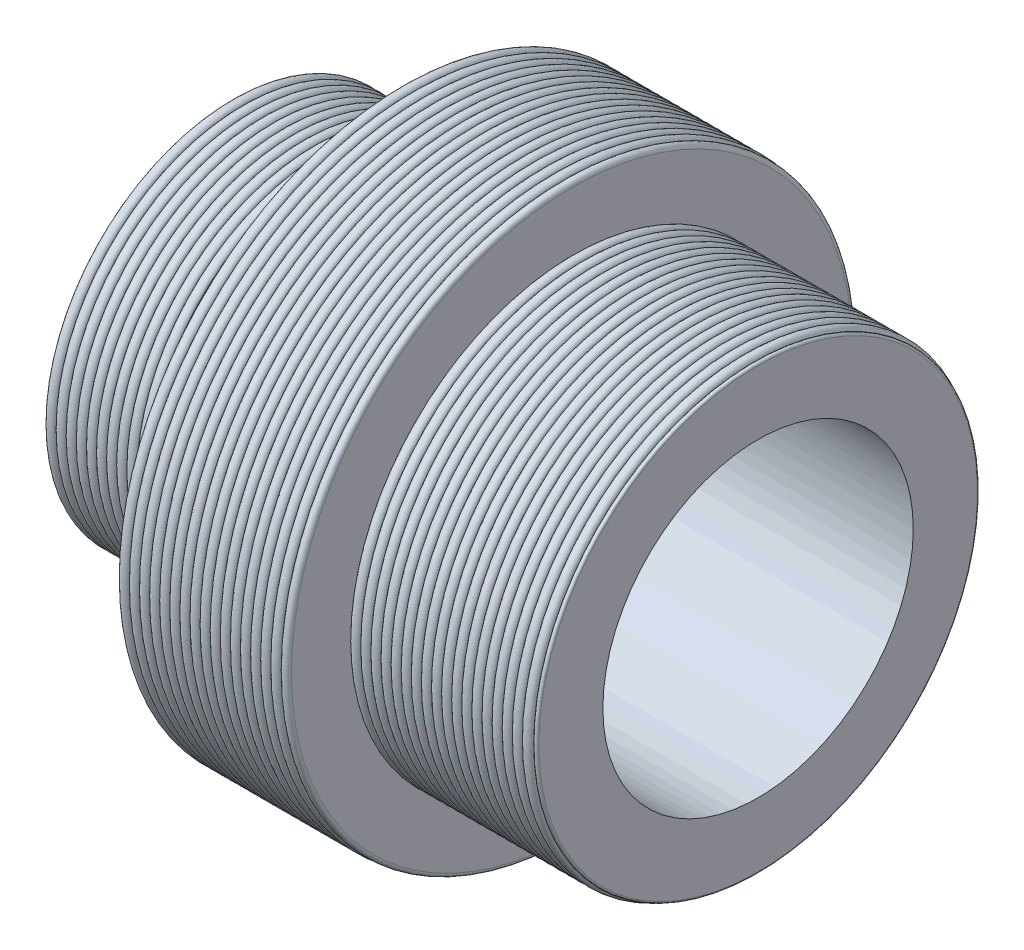
ISO-10303-21;
HEADER;
FILE_DESCRIPTION(('STEP AP214'),'2;1');
FILE_NAME('part.step','',(''),(''),'','','');
FILE_SCHEMA(('AUTOMOTIVE_DESIGN { 1 0 10303 214 1 1 1 1 }'));
ENDSEC;
DATA;
#1=APPLICATION_CONTEXT('core data for automotive mechanical design processes');
#2=APPLICATION_PROTOCOL_DEFINITION('international standard','automotive_design',2000,#1);
#3=PRODUCT_CONTEXT('',#1,'mechanical');
#4=PRODUCT('Part','Part','',(#3));
#5=PRODUCT_RELATED_PRODUCT_CATEGORY('part','',(#4));
#6=PRODUCT_DEFINITION_FORMATION('','',#4);
#7=PRODUCT_DEFINITION_CONTEXT('part definition',#1,'design');
#8=PRODUCT_DEFINITION('design','',#6,#7);
#9=PRODUCT_DEFINITION_SHAPE('','',#8);
#10=(LENGTH_UNIT() NAMED_UNIT(*) SI_UNIT(.MILLI.,.METRE.));
#11=(NAMED_UNIT(*) PLANE_ANGLE_UNIT() SI_UNIT($,.RADIAN.));
#12=(NAMED_UNIT(*) SI_UNIT($,.STERADIAN.) SOLID_ANGLE_UNIT());
#13=UNCERTAINTY_MEASURE_WITH_UNIT(LENGTH_MEASURE(1.E-05),#10,'distance_accuracy_value','');
#14=(GEOMETRIC_REPRESENTATION_CONTEXT(3) GLOBAL_UNCERTAINTY_ASSIGNED_CONTEXT((#13)) GLOBAL_UNIT_ASSIGNED_CONTEXT((#10,
#11,#12)) REPRESENTATION_CONTEXT('',''));
#15=CARTESIAN_POINT('',(0.,0.,0.));
#16=DIRECTION('',(0.,0.,1.));
#17=DIRECTION('',(1.,0.,0.));
#18=AXIS2_PLACEMENT_3D('',#15,#16,#17);
#19=CARTESIAN_POINT('',(-19.8,0.,0.));
#20=DIRECTION('',(-1.,0.,0.));
#21=DIRECTION('',(0.,0.,1.));
#22=AXIS2_PLACEMENT_3D('',#19,#20,#21);
#23=TOROIDAL_SURFACE('',#22,34.565,0.799999999999999);
#24=CARTESIAN_POINT('',(-19.,0.,0.));
#25=DIRECTION('',(-1.,0.,0.));
#26=DIRECTION('',(0.,0.,1.));
#27=AXIS2_PLACEMENT_3D('',#24,#25,#26);
#28=CIRCLE('',#27,34.565);
#29=CARTESIAN_POINT('',(-19.,0.,34.565));
#30=VERTEX_POINT('',#29);
#31=EDGE_CURVE('E274',#30,#30,#28,.T.);
#32=ORIENTED_EDGE('',*,*,#31,.T.);
#33=EDGE_LOOP('',(#32));
#34=FACE_BOUND('',#33,.T.);
#35=CARTESIAN_POINT('',(-20.6,0.,0.));
#36=DIRECTION('',(-1.,0.,0.));
#37=DIRECTION('',(0.,0.,1.));
#38=AXIS2_PLACEMENT_3D('',#35,#36,#37);
#39=CIRCLE('',#38,34.565);
#40=CARTESIAN_POINT('',(-20.6,0.,34.565));
#41=VERTEX_POINT('',#40);
#42=EDGE_CURVE('E10',#41,#41,#39,.T.);
#43=ORIENTED_EDGE('',*,*,#42,.F.);
#44=EDGE_LOOP('',(#43));
#45=FACE_BOUND('',#44,.T.);
#46=ADVANCED_FACE('F39',(#34,#45),#23,.T.);
#47=CARTESIAN_POINT('',(-21.55,0.,0.));
#48=DIRECTION('',(-1.,0.,0.));
#49=DIRECTION('',(0.,0.,1.));
#50=AXIS2_PLACEMENT_3D('',#47,#48,#49);
#51=TOROIDAL_SURFACE('',#50,34.565,0.95);
#52=ORIENTED_EDGE('',*,*,#42,.T.);
#53=EDGE_LOOP('',(#52));
#54=FACE_BOUND('',#53,.T.);
#55=CARTESIAN_POINT('',(-22.5,0.,0.));
#56=DIRECTION('',(-1.,0.,0.));
#57=DIRECTION('',(0.,0.,1.));
#58=AXIS2_PLACEMENT_3D('',#55,#56,#57);
#59=CIRCLE('',#58,34.565);
#60=CARTESIAN_POINT('',(-22.5,0.,34.565));
#61=VERTEX_POINT('',#60);
#62=EDGE_CURVE('E46',#61,#61,#59,.T.);
#63=ORIENTED_EDGE('',*,*,#62,.F.);
#64=EDGE_LOOP('',(#63));
#65=FACE_BOUND('',#64,.T.);
#66=ADVANCED_FACE('F293',(#54,#65),#51,.T.);
#67=CARTESIAN_POINT('',(-23.45,0.,0.));
#68=DIRECTION('',(-1.,0.,0.));
#69=DIRECTION('',(0.,0.,1.));
#70=AXIS2_PLACEMENT_3D('',#67,#68,#69);
#71=TOROIDAL_SURFACE('',#70,34.565,0.95);
#72=ORIENTED_EDGE('',*,*,#62,.T.);
#73=EDGE_LOOP('',(#72));
#74=FACE_BOUND('',#73,.T.);
#75=CARTESIAN_POINT('',(-24.4,0.,0.));
#76=DIRECTION('',(-1.,0.,0.));
#77=DIRECTION('',(0.,0.,1.));
#78=AXIS2_PLACEMENT_3D('',#75,#76,#77);
#79=CIRCLE('',#78,34.565);
#80=CARTESIAN_POINT('',(-24.4,0.,34.565));
#81=VERTEX_POINT('',#80);
#82=EDGE_CURVE('E51',#81,#81,#79,.T.);
#83=ORIENTED_EDGE('',*,*,#82,.F.);
#84=EDGE_LOOP('',(#83));
#85=FACE_BOUND('',#84,.T.);
#86=ADVANCED_FACE('F297',(#74,#85),#71,.T.);
#87=CARTESIAN_POINT('',(-25.35,0.,0.));
#88=DIRECTION('',(-1.,0.,0.));
#89=DIRECTION('',(0.,0.,1.));
#90=AXIS2_PLACEMENT_3D('',#87,#88,#89);
#91=TOROIDAL_SURFACE('',#90,34.565,0.95);
#92=ORIENTED_EDGE('',*,*,#82,.T.);
#93=EDGE_LOOP('',(#92));
#94=FACE_BOUND('',#93,.T.);
#95=CARTESIAN_POINT('',(-26.3,0.,0.));
#96=DIRECTION('',(-1.,0.,0.));
#97=DIRECTION('',(0.,0.,1.));
#98=AXIS2_PLACEMENT_3D('',#95,#96,#97);
#99=CIRCLE('',#98,34.565);
#100=CARTESIAN_POINT('',(-26.3,0.,34.565));
#101=VERTEX_POINT('',#100);
#102=EDGE_CURVE('E56',#101,#101,#99,.T.);
#103=ORIENTED_EDGE('',*,*,#102,.F.);
#104=EDGE_LOOP('',(#103));
#105=FACE_BOUND('',#104,.T.);
#106=ADVANCED_FACE('F301',(#94,#105),#91,.T.);
#107=CARTESIAN_POINT('',(-27.25,0.,0.));
#108=DIRECTION('',(-1.,0.,0.));
#109=DIRECTION('',(0.,0.,1.));
#110=AXIS2_PLACEMENT_3D('',#107,#108,#109);
#111=TOROIDAL_SURFACE('',#110,34.565,0.95);
#112=ORIENTED_EDGE('',*,*,#102,.T.);
#113=EDGE_LOOP('',(#112));
#114=FACE_BOUND('',#113,.T.);
#115=CARTESIAN_POINT('',(-28.2,0.,0.));
#116=DIRECTION('',(-1.,0.,0.));
#117=DIRECTION('',(0.,0.,1.));
#118=AXIS2_PLACEMENT_3D('',#115,#116,#117);
#119=CIRCLE('',#118,34.565);
#120=CARTESIAN_POINT('',(-28.2,0.,34.565));
#121=VERTEX_POINT('',#120);
#122=EDGE_CURVE('E62',#121,#121,#119,.T.);
#123=ORIENTED_EDGE('',*,*,#122,.F.);
#124=EDGE_LOOP('',(#123));
#125=FACE_BOUND('',#124,.T.);
#126=ADVANCED_FACE('F307',(#114,#125),#111,.T.);
#127=CARTESIAN_POINT('',(-29.15,0.,0.));
#128=DIRECTION('',(-1.,0.,0.));
#129=DIRECTION('',(0.,0.,1.));
#130=AXIS2_PLACEMENT_3D('',#127,#128,#129);
#131=TOROIDAL_SURFACE('',#130,34.565,0.95);
#132=ORIENTED_EDGE('',*,*,#122,.T.);
#133=EDGE_LOOP('',(#132));
#134=FACE_BOUND('',#133,.T.);
#135=CARTESIAN_POINT('',(-30.1,0.,0.));
#136=DIRECTION('',(-1.,0.,0.));
#137=DIRECTION('',(0.,0.,1.));
#138=AXIS2_PLACEMENT_3D('',#135,#136,#137);
#139=CIRCLE('',#138,34.565);
#140=CARTESIAN_POINT('',(-30.1,0.,34.565));
#141=VERTEX_POINT('',#140);
#142=EDGE_CURVE('E66',#141,#141,#139,.T.);
#143=ORIENTED_EDGE('',*,*,#142,.F.);
#144=EDGE_LOOP('',(#143));
#145=FACE_BOUND('',#144,.T.);
#146=ADVANCED_FACE('F311',(#134,#145),#131,.T.);
#147=CARTESIAN_POINT('',(-31.05,0.,0.));
#148=DIRECTION('',(-1.,0.,0.));
#149=DIRECTION('',(0.,0.,1.));
#150=AXIS2_PLACEMENT_3D('',#147,#148,#149);
#151=TOROIDAL_SURFACE('',#150,34.565,0.95);
#152=ORIENTED_EDGE('',*,*,#142,.T.);
#153=EDGE_LOOP('',(#152));
#154=FACE_BOUND('',#153,.T.);
#155=CARTESIAN_POINT('',(-32.,0.,0.));
#156=DIRECTION('',(-1.,0.,0.));
#157=DIRECTION('',(0.,0.,1.));
#158=AXIS2_PLACEMENT_3D('',#155,#156,#157);
#159=CIRCLE('',#158,34.565);
#160=CARTESIAN_POINT('',(-32.,0.,34.565));
#161=VERTEX_POINT('',#160);
#162=EDGE_CURVE('E70',#161,#161,#159,.T.);
#163=ORIENTED_EDGE('',*,*,#162,.F.);
#164=EDGE_LOOP('',(#163));
#165=FACE_BOUND('',#164,.T.);
#166=ADVANCED_FACE('F315',(#154,#165),#151,.T.);
#167=CARTESIAN_POINT('',(-32.95,0.,0.));
#168=DIRECTION('',(-1.,0.,0.));
#169=DIRECTION('',(0.,0.,1.));
#170=AXIS2_PLACEMENT_3D('',#167,#168,#169);
#171=TOROIDAL_SURFACE('',#170,34.565,0.95);
#172=ORIENTED_EDGE('',*,*,#162,.T.);
#173=EDGE_LOOP('',(#172));
#174=FACE_BOUND('',#173,.T.);
#175=CARTESIAN_POINT('',(-33.9,0.,0.));
#176=DIRECTION('',(-1.,0.,0.));
#177=DIRECTION('',(0.,0.,1.));
#178=AXIS2_PLACEMENT_3D('',#175,#176,#177);
#179=CIRCLE('',#178,34.565);
#180=CARTESIAN_POINT('',(-33.9,0.,34.565));
#181=VERTEX_POINT('',#180);
#182=EDGE_CURVE('E74',#181,#181,#179,.T.);
#183=ORIENTED_EDGE('',*,*,#182,.F.);
#184=EDGE_LOOP('',(#183));
#185=FACE_BOUND('',#184,.T.);
#186=ADVANCED_FACE('F319',(#174,#185),#171,.T.);
#187=CARTESIAN_POINT('',(-34.85,0.,0.));
#188=DIRECTION('',(-1.,0.,0.));
#189=DIRECTION('',(0.,0.,1.));
#190=AXIS2_PLACEMENT_3D('',#187,#188,#189);
#191=TOROIDAL_SURFACE('',#190,34.565,0.95);
#192=ORIENTED_EDGE('',*,*,#182,.T.);
#193=EDGE_LOOP('',(#192));
#194=FACE_BOUND('',#193,.T.);
#195=CARTESIAN_POINT('',(-35.8,0.,0.));
#196=DIRECTION('',(-1.,0.,0.));
#197=DIRECTION('',(0.,0.,1.));
#198=AXIS2_PLACEMENT_3D('',#195,#196,#197);
#199=CIRCLE('',#198,34.565);
#200=CARTESIAN_POINT('',(-35.8,0.,34.565));
#201=VERTEX_POINT('',#200);
#202=EDGE_CURVE('E78',#201,#201,#199,.T.);
#203=ORIENTED_EDGE('',*,*,#202,.F.);
#204=EDGE_LOOP('',(#203));
#205=FACE_BOUND('',#204,.T.);
#206=ADVANCED_FACE('F323',(#194,#205),#191,.T.);
#207=CARTESIAN_POINT('',(-36.75,0.,0.));
#208=DIRECTION('',(-1.,0.,0.));
#209=DIRECTION('',(0.,0.,1.));
#210=AXIS2_PLACEMENT_3D('',#207,#208,#209);
#211=TOROIDAL_SURFACE('',#210,34.565,0.95);
#212=ORIENTED_EDGE('',*,*,#202,.T.);
#213=EDGE_LOOP('',(#212));
#214=FACE_BOUND('',#213,.T.);
#215=CARTESIAN_POINT('',(-37.7,0.,0.));
#216=DIRECTION('',(-1.,0.,0.));
#217=DIRECTION('',(0.,0.,1.));
#218=AXIS2_PLACEMENT_3D('',#215,#216,#217);
#219=CIRCLE('',#218,34.565);
#220=CARTESIAN_POINT('',(-37.7,0.,34.565));
#221=VERTEX_POINT('',#220);
#222=EDGE_CURVE('E82',#221,#221,#219,.T.);
#223=ORIENTED_EDGE('',*,*,#222,.F.);
#224=EDGE_LOOP('',(#223));
#225=FACE_BOUND('',#224,.T.);
#226=ADVANCED_FACE('F327',(#214,#225),#211,.T.);
#227=CARTESIAN_POINT('',(-38.65,0.,0.));
#228=DIRECTION('',(-1.,0.,0.));
#229=DIRECTION('',(0.,0.,1.));
#230=AXIS2_PLACEMENT_3D('',#227,#228,#229);
#231=TOROIDAL_SURFACE('',#230,34.565,0.95);
#232=ORIENTED_EDGE('',*,*,#222,.T.);
#233=EDGE_LOOP('',(#232));
#234=FACE_BOUND('',#233,.T.);
#235=CARTESIAN_POINT('',(-39.6,0.,0.));
#236=DIRECTION('',(-1.,0.,0.));
#237=DIRECTION('',(0.,0.,1.));
#238=AXIS2_PLACEMENT_3D('',#235,#236,#237);
#239=CIRCLE('',#238,34.565);
#240=CARTESIAN_POINT('',(-39.6,0.,34.565));
#241=VERTEX_POINT('',#240);
#242=EDGE_CURVE('E86',#241,#241,#239,.T.);
#243=ORIENTED_EDGE('',*,*,#242,.F.);
#244=EDGE_LOOP('',(#243));
#245=FACE_BOUND('',#244,.T.);
#246=ADVANCED_FACE('F331',(#234,#245),#231,.T.);
#247=CARTESIAN_POINT('',(-40.55,0.,0.));
#248=DIRECTION('',(-1.,0.,0.));
#249=DIRECTION('',(0.,0.,1.));
#250=AXIS2_PLACEMENT_3D('',#247,#248,#249);
#251=TOROIDAL_SURFACE('',#250,34.565,0.95);
#252=ORIENTED_EDGE('',*,*,#242,.T.);
#253=EDGE_LOOP('',(#252));
#254=FACE_BOUND('',#253,.T.);
#255=CARTESIAN_POINT('',(-41.5,0.,0.));
#256=DIRECTION('',(-1.,0.,0.));
#257=DIRECTION('',(0.,0.,1.));
#258=AXIS2_PLACEMENT_3D('',#255,#256,#257);
#259=CIRCLE('',#258,34.565);
#260=CARTESIAN_POINT('',(-41.5,0.,34.565));
#261=VERTEX_POINT('',#260);
#262=EDGE_CURVE('E90',#261,#261,#259,.T.);
#263=ORIENTED_EDGE('',*,*,#262,.F.);
#264=EDGE_LOOP('',(#263));
#265=FACE_BOUND('',#264,.T.);
#266=ADVANCED_FACE('F335',(#254,#265),#251,.T.);
#267=CARTESIAN_POINT('',(-42.45,0.,0.));
#268=DIRECTION('',(-1.,0.,0.));
#269=DIRECTION('',(0.,0.,1.));
#270=AXIS2_PLACEMENT_3D('',#267,#268,#269);
#271=TOROIDAL_SURFACE('',#270,34.565,0.95);
#272=ORIENTED_EDGE('',*,*,#262,.T.);
#273=EDGE_LOOP('',(#272));
#274=FACE_BOUND('',#273,.T.);
#275=CARTESIAN_POINT('',(-43.4,0.,0.));
#276=DIRECTION('',(-1.,0.,0.));
#277=DIRECTION('',(0.,0.,1.));
#278=AXIS2_PLACEMENT_3D('',#275,#276,#277);
#279=CIRCLE('',#278,34.565);
#280=CARTESIAN_POINT('',(-43.4,0.,34.565));
#281=VERTEX_POINT('',#280);
#282=EDGE_CURVE('E94',#281,#281,#279,.T.);
#283=ORIENTED_EDGE('',*,*,#282,.F.);
#284=EDGE_LOOP('',(#283));
#285=FACE_BOUND('',#284,.T.);
#286=ADVANCED_FACE('F339',(#274,#285),#271,.T.);
#287=CARTESIAN_POINT('',(-44.35,0.,0.));
#288=DIRECTION('',(-1.,0.,0.));
#289=DIRECTION('',(0.,0.,1.));
#290=AXIS2_PLACEMENT_3D('',#287,#288,#289);
#291=TOROIDAL_SURFACE('',#290,34.565,0.95);
#292=ORIENTED_EDGE('',*,*,#282,.T.);
#293=EDGE_LOOP('',(#292));
#294=FACE_BOUND('',#293,.T.);
#295=CARTESIAN_POINT('',(-45.3,0.,0.));
#296=DIRECTION('',(-1.,0.,0.));
#297=DIRECTION('',(0.,0.,1.));
#298=AXIS2_PLACEMENT_3D('',#295,#296,#297);
#299=CIRCLE('',#298,34.565);
#300=CARTESIAN_POINT('',(-45.3,0.,34.565));
#301=VERTEX_POINT('',#300);
#302=EDGE_CURVE('E98',#301,#301,#299,.T.);
#303=ORIENTED_EDGE('',*,*,#302,.F.);
#304=EDGE_LOOP('',(#303));
#305=FACE_BOUND('',#304,.T.);
#306=ADVANCED_FACE('F343',(#294,#305),#291,.T.);
#307=CARTESIAN_POINT('',(-46.25,0.,0.));
#308=DIRECTION('',(-1.,0.,0.));
#309=DIRECTION('',(0.,0.,1.));
#310=AXIS2_PLACEMENT_3D('',#307,#308,#309);
#311=TOROIDAL_SURFACE('',#310,34.565,0.95);
#312=ORIENTED_EDGE('',*,*,#302,.T.);
#313=EDGE_LOOP('',(#312));
#314=FACE_BOUND('',#313,.T.);
#315=CARTESIAN_POINT('',(-47.2,0.,0.));
#316=DIRECTION('',(-1.,0.,0.));
#317=DIRECTION('',(0.,0.,1.));
#318=AXIS2_PLACEMENT_3D('',#315,#316,#317);
#319=CIRCLE('',#318,34.565);
#320=CARTESIAN_POINT('',(-47.2,0.,34.565));
#321=VERTEX_POINT('',#320);
#322=EDGE_CURVE('E102',#321,#321,#319,.T.);
#323=ORIENTED_EDGE('',*,*,#322,.F.);
#324=EDGE_LOOP('',(#323));
#325=FACE_BOUND('',#324,.T.);
#326=ADVANCED_FACE('F347',(#314,#325),#311,.T.);
#327=CARTESIAN_POINT('',(-48.15,0.,0.));
#328=DIRECTION('',(-1.,0.,0.));
#329=DIRECTION('',(0.,0.,1.));
#330=AXIS2_PLACEMENT_3D('',#327,#328,#329);
#331=TOROIDAL_SURFACE('',#330,34.565,0.95);
#332=ORIENTED_EDGE('',*,*,#322,.T.);
#333=EDGE_LOOP('',(#332));
#334=FACE_BOUND('',#333,.T.);
#335=CARTESIAN_POINT('',(-49.1,0.,0.));
#336=DIRECTION('',(-1.,0.,0.));
#337=DIRECTION('',(0.,0.,1.));
#338=AXIS2_PLACEMENT_3D('',#335,#336,#337);
#339=CIRCLE('',#338,34.565);
#340=CARTESIAN_POINT('',(-49.1,0.,34.565));
#341=VERTEX_POINT('',#340);
#342=EDGE_CURVE('E106',#341,#341,#339,.T.);
#343=ORIENTED_EDGE('',*,*,#342,.F.);
#344=EDGE_LOOP('',(#343));
#345=FACE_BOUND('',#344,.T.);
#346=ADVANCED_FACE('F351',(#334,#345),#331,.T.);
#347=CARTESIAN_POINT('',(-50.05,0.,0.));
#348=DIRECTION('',(-1.,0.,0.));
#349=DIRECTION('',(0.,0.,1.));
#350=AXIS2_PLACEMENT_3D('',#347,#348,#349);
#351=TOROIDAL_SURFACE('',#350,34.565,0.95);
#352=ORIENTED_EDGE('',*,*,#342,.T.);
#353=EDGE_LOOP('',(#352));
#354=FACE_BOUND('',#353,.T.);
#355=CARTESIAN_POINT('',(-51.,0.,0.));
#356=DIRECTION('',(-1.,0.,0.));
#357=DIRECTION('',(0.,0.,1.));
#358=AXIS2_PLACEMENT_3D('',#355,#356,#357);
#359=CIRCLE('',#358,34.565);
#360=CARTESIAN_POINT('',(-51.,0.,34.565));
#361=VERTEX_POINT('',#360);
#362=EDGE_CURVE('E110',#361,#361,#359,.T.);
#363=ORIENTED_EDGE('',*,*,#362,.F.);
#364=EDGE_LOOP('',(#363));
#365=FACE_BOUND('',#364,.T.);
#366=ADVANCED_FACE('F355',(#354,#365),#351,.T.);
#367=CARTESIAN_POINT('',(-51.,0.,0.));
#368=DIRECTION('',(-1.,0.,0.));
#369=DIRECTION('',(0.,0.,1.));
#370=AXIS2_PLACEMENT_3D('',#367,#368,#369);
#371=PLANE('',#370);
#372=ORIENTED_EDGE('',*,*,#362,.T.);
#373=EDGE_LOOP('',(#372));
#374=FACE_BOUND('',#373,.T.);
#375=CARTESIAN_POINT('',(-51.,0.,0.));
#376=DIRECTION('',(-1.,0.,0.));
#377=DIRECTION('',(0.,0.,1.));
#378=AXIS2_PLACEMENT_3D('',#375,#376,#377);
#379=CIRCLE('',#378,29.195);
#380=CARTESIAN_POINT('',(-51.,0.,29.195));
#381=VERTEX_POINT('',#380);
#382=EDGE_CURVE('E114',#381,#381,#379,.T.);
#383=ORIENTED_EDGE('',*,*,#382,.F.);
#384=EDGE_LOOP('',(#383));
#385=FACE_BOUND('',#384,.T.);
#386=ADVANCED_FACE('F359',(#374,#385),#371,.T.);
#387=CARTESIAN_POINT('',(-55.,0.,0.));
#388=DIRECTION('',(-1.,0.,0.));
#389=DIRECTION('',(0.,0.,1.));
#390=AXIS2_PLACEMENT_3D('',#387,#388,#389);
#391=CYLINDRICAL_SURFACE('',#390,29.195);
#392=ORIENTED_EDGE('',*,*,#382,.T.);
#393=EDGE_LOOP('',(#392));
#394=FACE_BOUND('',#393,.T.);
#395=CARTESIAN_POINT('',(48.,0.,0.));
#396=DIRECTION('',(-1.,0.,0.));
#397=DIRECTION('',(0.,0.,1.));
#398=AXIS2_PLACEMENT_3D('',#395,#396,#397);
#399=CIRCLE('',#398,29.195);
#400=CARTESIAN_POINT('',(48.,0.,29.195));
#401=VERTEX_POINT('',#400);
#402=EDGE_CURVE('E118',#401,#401,#399,.T.);
#403=ORIENTED_EDGE('',*,*,#402,.F.);
#404=EDGE_LOOP('',(#403));
#405=FACE_BOUND('',#404,.T.);
#406=ADVANCED_FACE('F363',(#394,#405),#391,.F.);
#407=CARTESIAN_POINT('',(48.,0.,0.));
#408=DIRECTION('',(-1.,0.,0.));
#409=DIRECTION('',(0.,0.,1.));
#410=AXIS2_PLACEMENT_3D('',#407,#408,#409);
#411=PLANE('',#410);
#412=CARTESIAN_POINT('',(48.,0.,0.));
#413=DIRECTION('',(-1.,0.,0.));
#414=DIRECTION('',(0.,0.,1.));
#415=AXIS2_PLACEMENT_3D('',#412,#413,#414);
#416=CIRCLE('',#415,41.245);
#417=CARTESIAN_POINT('',(48.,0.,41.245));
#418=VERTEX_POINT('',#417);
#419=EDGE_CURVE('E122',#418,#418,#416,.T.);
#420=ORIENTED_EDGE('',*,*,#419,.F.);
#421=EDGE_LOOP('',(#420));
#422=FACE_BOUND('',#421,.T.);
#423=ORIENTED_EDGE('',*,*,#402,.T.);
#424=EDGE_LOOP('',(#423));
#425=FACE_BOUND('',#424,.T.);
#426=ADVANCED_FACE('F367',(#422,#425),#411,.F.);
#427=CARTESIAN_POINT('',(47.6,0.,0.));
#428=DIRECTION('',(-1.,0.,0.));
#429=DIRECTION('',(0.,0.,1.));
#430=AXIS2_PLACEMENT_3D('',#427,#428,#429);
#431=TOROIDAL_SURFACE('',#430,41.245,0.399999999999998);
#432=ORIENTED_EDGE('',*,*,#419,.T.);
#433=EDGE_LOOP('',(#432));
#434=FACE_BOUND('',#433,.T.);
#435=CARTESIAN_POINT('',(47.2,0.,0.));
#436=DIRECTION('',(-1.,0.,0.));
#437=DIRECTION('',(0.,0.,1.));
#438=AXIS2_PLACEMENT_3D('',#435,#436,#437);
#439=CIRCLE('',#438,41.245);
#440=CARTESIAN_POINT('',(47.2,0.,41.245));
#441=VERTEX_POINT('',#440);
#442=EDGE_CURVE('E126',#441,#441,#439,.T.);
#443=ORIENTED_EDGE('',*,*,#442,.F.);
#444=EDGE_LOOP('',(#443));
#445=FACE_BOUND('',#444,.T.);
#446=ADVANCED_FACE('F371',(#434,#445),#431,.T.);
#447=CARTESIAN_POINT('',(46.25,0.,0.));
#448=DIRECTION('',(-1.,0.,0.));
#449=DIRECTION('',(0.,0.,1.));
#450=AXIS2_PLACEMENT_3D('',#447,#448,#449);
#451=TOROIDAL_SURFACE('',#450,41.245,0.95);
#452=ORIENTED_EDGE('',*,*,#442,.T.);
#453=EDGE_LOOP('',(#452));
#454=FACE_BOUND('',#453,.T.);
#455=CARTESIAN_POINT('',(45.3,0.,0.));
#456=DIRECTION('',(-1.,0.,0.));
#457=DIRECTION('',(0.,0.,1.));
#458=AXIS2_PLACEMENT_3D('',#455,#456,#457);
#459=CIRCLE('',#458,41.245);
#460=CARTESIAN_POINT('',(45.3,0.,41.245));
#461=VERTEX_POINT('',#460);
#462=EDGE_CURVE('E130',#461,#461,#459,.T.);
#463=ORIENTED_EDGE('',*,*,#462,.F.);
#464=EDGE_LOOP('',(#463));
#465=FACE_BOUND('',#464,.T.);
#466=ADVANCED_FACE('F375',(#454,#465),#451,.T.);
#467=CARTESIAN_POINT('',(44.35,0.,0.));
#468=DIRECTION('',(-1.,0.,0.));
#469=DIRECTION('',(0.,0.,1.));
#470=AXIS2_PLACEMENT_3D('',#467,#468,#469);
#471=TOROIDAL_SURFACE('',#470,41.245,0.95);
#472=ORIENTED_EDGE('',*,*,#462,.T.);
#473=EDGE_LOOP('',(#472));
#474=FACE_BOUND('',#473,.T.);
#475=CARTESIAN_POINT('',(43.4,0.,0.));
#476=DIRECTION('',(-1.,0.,0.));
#477=DIRECTION('',(0.,0.,1.));
#478=AXIS2_PLACEMENT_3D('',#475,#476,#477);
#479=CIRCLE('',#478,41.245);
#480=CARTESIAN_POINT('',(43.4,0.,41.245));
#481=VERTEX_POINT('',#480);
#482=EDGE_CURVE('E134',#481,#481,#479,.T.);
#483=ORIENTED_EDGE('',*,*,#482,.F.);
#484=EDGE_LOOP('',(#483));
#485=FACE_BOUND('',#484,.T.);
#486=ADVANCED_FACE('F379',(#474,#485),#471,.T.);
#487=CARTESIAN_POINT('',(42.45,0.,0.));
#488=DIRECTION('',(-1.,0.,0.));
#489=DIRECTION('',(0.,0.,1.));
#490=AXIS2_PLACEMENT_3D('',#487,#488,#489);
#491=TOROIDAL_SURFACE('',#490,41.245,0.95);
#492=ORIENTED_EDGE('',*,*,#482,.T.);
#493=EDGE_LOOP('',(#492));
#494=FACE_BOUND('',#493,.T.);
#495=CARTESIAN_POINT('',(41.5,0.,0.));
#496=DIRECTION('',(-1.,0.,0.));
#497=DIRECTION('',(0.,0.,1.));
#498=AXIS2_PLACEMENT_3D('',#495,#496,#497);
#499=CIRCLE('',#498,41.245);
#500=CARTESIAN_POINT('',(41.5,0.,41.245));
#501=VERTEX_POINT('',#500);
#502=EDGE_CURVE('E138',#501,#501,#499,.T.);
#503=ORIENTED_EDGE('',*,*,#502,.F.);
#504=EDGE_LOOP('',(#503));
#505=FACE_BOUND('',#504,.T.);
#506=ADVANCED_FACE('F383',(#494,#505),#491,.T.);
#507=CARTESIAN_POINT('',(40.55,0.,0.));
#508=DIRECTION('',(-1.,0.,0.));
#509=DIRECTION('',(0.,0.,1.));
#510=AXIS2_PLACEMENT_3D('',#507,#508,#509);
#511=TOROIDAL_SURFACE('',#510,41.245,0.95);
#512=ORIENTED_EDGE('',*,*,#502,.T.);
#513=EDGE_LOOP('',(#512));
#514=FACE_BOUND('',#513,.T.);
#515=CARTESIAN_POINT('',(39.6,0.,0.));
#516=DIRECTION('',(-1.,0.,0.));
#517=DIRECTION('',(0.,0.,1.));
#518=AXIS2_PLACEMENT_3D('',#515,#516,#517);
#519=CIRCLE('',#518,41.245);
#520=CARTESIAN_POINT('',(39.6,0.,41.245));
#521=VERTEX_POINT('',#520);
#522=EDGE_CURVE('E142',#521,#521,#519,.T.);
#523=ORIENTED_EDGE('',*,*,#522,.F.);
#524=EDGE_LOOP('',(#523));
#525=FACE_BOUND('',#524,.T.);
#526=ADVANCED_FACE('F387',(#514,#525),#511,.T.);
#527=CARTESIAN_POINT('',(38.65,0.,0.));
#528=DIRECTION('',(-1.,0.,0.));
#529=DIRECTION('',(0.,0.,1.));
#530=AXIS2_PLACEMENT_3D('',#527,#528,#529);
#531=TOROIDAL_SURFACE('',#530,41.245,0.95);
#532=ORIENTED_EDGE('',*,*,#522,.T.);
#533=EDGE_LOOP('',(#532));
#534=FACE_BOUND('',#533,.T.);
#535=CARTESIAN_POINT('',(37.7,0.,0.));
#536=DIRECTION('',(-1.,0.,0.));
#537=DIRECTION('',(0.,0.,1.));
#538=AXIS2_PLACEMENT_3D('',#535,#536,#537);
#539=CIRCLE('',#538,41.245);
#540=CARTESIAN_POINT('',(37.7,0.,41.245));
#541=VERTEX_POINT('',#540);
#542=EDGE_CURVE('E146',#541,#541,#539,.T.);
#543=ORIENTED_EDGE('',*,*,#542,.F.);
#544=EDGE_LOOP('',(#543));
#545=FACE_BOUND('',#544,.T.);
#546=ADVANCED_FACE('F391',(#534,#545),#531,.T.);
#547=CARTESIAN_POINT('',(36.75,0.,0.));
#548=DIRECTION('',(-1.,0.,0.));
#549=DIRECTION('',(0.,0.,1.));
#550=AXIS2_PLACEMENT_3D('',#547,#548,#549);
#551=TOROIDAL_SURFACE('',#550,41.245,0.95);
#552=ORIENTED_EDGE('',*,*,#542,.T.);
#553=EDGE_LOOP('',(#552));
#554=FACE_BOUND('',#553,.T.);
#555=CARTESIAN_POINT('',(35.8,0.,0.));
#556=DIRECTION('',(-1.,0.,0.));
#557=DIRECTION('',(0.,0.,1.));
#558=AXIS2_PLACEMENT_3D('',#555,#556,#557);
#559=CIRCLE('',#558,41.245);
#560=CARTESIAN_POINT('',(35.8,0.,41.245));
#561=VERTEX_POINT('',#560);
#562=EDGE_CURVE('E150',#561,#561,#559,.T.);
#563=ORIENTED_EDGE('',*,*,#562,.F.);
#564=EDGE_LOOP('',(#563));
#565=FACE_BOUND('',#564,.T.);
#566=ADVANCED_FACE('F395',(#554,#565),#551,.T.);
#567=CARTESIAN_POINT('',(34.85,0.,0.));
#568=DIRECTION('',(-1.,0.,0.));
#569=DIRECTION('',(0.,0.,1.));
#570=AXIS2_PLACEMENT_3D('',#567,#568,#569);
#571=TOROIDAL_SURFACE('',#570,41.245,0.95);
#572=ORIENTED_EDGE('',*,*,#562,.T.);
#573=EDGE_LOOP('',(#572));
#574=FACE_BOUND('',#573,.T.);
#575=CARTESIAN_POINT('',(33.9,0.,0.));
#576=DIRECTION('',(-1.,0.,0.));
#577=DIRECTION('',(0.,0.,1.));
#578=AXIS2_PLACEMENT_3D('',#575,#576,#577);
#579=CIRCLE('',#578,41.245);
#580=CARTESIAN_POINT('',(33.9,0.,41.245));
#581=VERTEX_POINT('',#580);
#582=EDGE_CURVE('E154',#581,#581,#579,.T.);
#583=ORIENTED_EDGE('',*,*,#582,.F.);
#584=EDGE_LOOP('',(#583));
#585=FACE_BOUND('',#584,.T.);
#586=ADVANCED_FACE('F399',(#574,#585),#571,.T.);
#587=CARTESIAN_POINT('',(32.95,0.,0.));
#588=DIRECTION('',(-1.,0.,0.));
#589=DIRECTION('',(0.,0.,1.));
#590=AXIS2_PLACEMENT_3D('',#587,#588,#589);
#591=TOROIDAL_SURFACE('',#590,41.245,0.95);
#592=ORIENTED_EDGE('',*,*,#582,.T.);
#593=EDGE_LOOP('',(#592));
#594=FACE_BOUND('',#593,.T.);
#595=CARTESIAN_POINT('',(32.,0.,0.));
#596=DIRECTION('',(-1.,0.,0.));
#597=DIRECTION('',(0.,0.,1.));
#598=AXIS2_PLACEMENT_3D('',#595,#596,#597);
#599=CIRCLE('',#598,41.245);
#600=CARTESIAN_POINT('',(32.,0.,41.245));
#601=VERTEX_POINT('',#600);
#602=EDGE_CURVE('E158',#601,#601,#599,.T.);
#603=ORIENTED_EDGE('',*,*,#602,.F.);
#604=EDGE_LOOP('',(#603));
#605=FACE_BOUND('',#604,.T.);
#606=ADVANCED_FACE('F403',(#594,#605),#591,.T.);
#607=CARTESIAN_POINT('',(31.05,0.,0.));
#608=DIRECTION('',(-1.,0.,0.));
#609=DIRECTION('',(0.,0.,1.));
#610=AXIS2_PLACEMENT_3D('',#607,#608,#609);
#611=TOROIDAL_SURFACE('',#610,41.245,0.95);
#612=ORIENTED_EDGE('',*,*,#602,.T.);
#613=EDGE_LOOP('',(#612));
#614=FACE_BOUND('',#613,.T.);
#615=CARTESIAN_POINT('',(30.1,0.,0.));
#616=DIRECTION('',(-1.,0.,0.));
#617=DIRECTION('',(0.,0.,1.));
#618=AXIS2_PLACEMENT_3D('',#615,#616,#617);
#619=CIRCLE('',#618,41.245);
#620=CARTESIAN_POINT('',(30.1,0.,41.245));
#621=VERTEX_POINT('',#620);
#622=EDGE_CURVE('E162',#621,#621,#619,.T.);
#623=ORIENTED_EDGE('',*,*,#622,.F.);
#624=EDGE_LOOP('',(#623));
#625=FACE_BOUND('',#624,.T.);
#626=ADVANCED_FACE('F407',(#614,#625),#611,.T.);
#627=CARTESIAN_POINT('',(29.15,0.,0.));
#628=DIRECTION('',(-1.,0.,0.));
#629=DIRECTION('',(0.,0.,1.));
#630=AXIS2_PLACEMENT_3D('',#627,#628,#629);
#631=TOROIDAL_SURFACE('',#630,41.245,0.95);
#632=ORIENTED_EDGE('',*,*,#622,.T.);
#633=EDGE_LOOP('',(#632));
#634=FACE_BOUND('',#633,.T.);
#635=CARTESIAN_POINT('',(28.2,0.,0.));
#636=DIRECTION('',(-1.,0.,0.));
#637=DIRECTION('',(0.,0.,1.));
#638=AXIS2_PLACEMENT_3D('',#635,#636,#637);
#639=CIRCLE('',#638,41.245);
#640=CARTESIAN_POINT('',(28.2,0.,41.245));
#641=VERTEX_POINT('',#640);
#642=EDGE_CURVE('E166',#641,#641,#639,.T.);
#643=ORIENTED_EDGE('',*,*,#642,.F.);
#644=EDGE_LOOP('',(#643));
#645=FACE_BOUND('',#644,.T.);
#646=ADVANCED_FACE('F411',(#634,#645),#631,.T.);
#647=CARTESIAN_POINT('',(27.25,0.,0.));
#648=DIRECTION('',(-1.,0.,0.));
#649=DIRECTION('',(0.,0.,1.));
#650=AXIS2_PLACEMENT_3D('',#647,#648,#649);
#651=TOROIDAL_SURFACE('',#650,41.245,0.95);
#652=ORIENTED_EDGE('',*,*,#642,.T.);
#653=EDGE_LOOP('',(#652));
#654=FACE_BOUND('',#653,.T.);
#655=CARTESIAN_POINT('',(26.3,0.,0.));
#656=DIRECTION('',(-1.,0.,0.));
#657=DIRECTION('',(0.,0.,1.));
#658=AXIS2_PLACEMENT_3D('',#655,#656,#657);
#659=CIRCLE('',#658,41.245);
#660=CARTESIAN_POINT('',(26.3,0.,41.245));
#661=VERTEX_POINT('',#660);
#662=EDGE_CURVE('E170',#661,#661,#659,.T.);
#663=ORIENTED_EDGE('',*,*,#662,.F.);
#664=EDGE_LOOP('',(#663));
#665=FACE_BOUND('',#664,.T.);
#666=ADVANCED_FACE('F415',(#654,#665),#651,.T.);
#667=CARTESIAN_POINT('',(25.35,0.,0.));
#668=DIRECTION('',(-1.,0.,0.));
#669=DIRECTION('',(0.,0.,1.));
#670=AXIS2_PLACEMENT_3D('',#667,#668,#669);
#671=TOROIDAL_SURFACE('',#670,41.245,0.95);
#672=ORIENTED_EDGE('',*,*,#662,.T.);
#673=EDGE_LOOP('',(#672));
#674=FACE_BOUND('',#673,.T.);
#675=CARTESIAN_POINT('',(24.4,0.,0.));
#676=DIRECTION('',(-1.,0.,0.));
#677=DIRECTION('',(0.,0.,1.));
#678=AXIS2_PLACEMENT_3D('',#675,#676,#677);
#679=CIRCLE('',#678,41.245);
#680=CARTESIAN_POINT('',(24.4,0.,41.245));
#681=VERTEX_POINT('',#680);
#682=EDGE_CURVE('E174',#681,#681,#679,.T.);
#683=ORIENTED_EDGE('',*,*,#682,.F.);
#684=EDGE_LOOP('',(#683));
#685=FACE_BOUND('',#684,.T.);
#686=ADVANCED_FACE('F419',(#674,#685),#671,.T.);
#687=CARTESIAN_POINT('',(23.45,0.,0.));
#688=DIRECTION('',(-1.,0.,0.));
#689=DIRECTION('',(0.,0.,1.));
#690=AXIS2_PLACEMENT_3D('',#687,#688,#689);
#691=TOROIDAL_SURFACE('',#690,41.245,0.95);
#692=ORIENTED_EDGE('',*,*,#682,.T.);
#693=EDGE_LOOP('',(#692));
#694=FACE_BOUND('',#693,.T.);
#695=CARTESIAN_POINT('',(22.5,0.,0.));
#696=DIRECTION('',(-1.,0.,0.));
#697=DIRECTION('',(0.,0.,1.));
#698=AXIS2_PLACEMENT_3D('',#695,#696,#697);
#699=CIRCLE('',#698,41.245);
#700=CARTESIAN_POINT('',(22.5,0.,41.245));
#701=VERTEX_POINT('',#700);
#702=EDGE_CURVE('E178',#701,#701,#699,.T.);
#703=ORIENTED_EDGE('',*,*,#702,.F.);
#704=EDGE_LOOP('',(#703));
#705=FACE_BOUND('',#704,.T.);
#706=ADVANCED_FACE('F423',(#694,#705),#691,.T.);
#707=CARTESIAN_POINT('',(21.55,0.,0.));
#708=DIRECTION('',(-1.,0.,0.));
#709=DIRECTION('',(0.,0.,1.));
#710=AXIS2_PLACEMENT_3D('',#707,#708,#709);
#711=TOROIDAL_SURFACE('',#710,41.245,0.95);
#712=ORIENTED_EDGE('',*,*,#702,.T.);
#713=EDGE_LOOP('',(#712));
#714=FACE_BOUND('',#713,.T.);
#715=CARTESIAN_POINT('',(20.6,0.,0.));
#716=DIRECTION('',(-1.,0.,0.));
#717=DIRECTION('',(0.,0.,1.));
#718=AXIS2_PLACEMENT_3D('',#715,#716,#717);
#719=CIRCLE('',#718,41.245);
#720=CARTESIAN_POINT('',(20.6,0.,41.245));
#721=VERTEX_POINT('',#720);
#722=EDGE_CURVE('E182',#721,#721,#719,.T.);
#723=ORIENTED_EDGE('',*,*,#722,.F.);
#724=EDGE_LOOP('',(#723));
#725=FACE_BOUND('',#724,.T.);
#726=ADVANCED_FACE('F427',(#714,#725),#711,.T.);
#727=CARTESIAN_POINT('',(19.65,0.,0.));
#728=DIRECTION('',(-1.,0.,0.));
#729=DIRECTION('',(0.,0.,1.));
#730=AXIS2_PLACEMENT_3D('',#727,#728,#729);
#731=TOROIDAL_SURFACE('',#730,41.245,0.95);
#732=ORIENTED_EDGE('',*,*,#722,.T.);
#733=EDGE_LOOP('',(#732));
#734=FACE_BOUND('',#733,.T.);
#735=CARTESIAN_POINT('',(18.7,0.,0.));
#736=DIRECTION('',(-1.,0.,0.));
#737=DIRECTION('',(0.,0.,1.));
#738=AXIS2_PLACEMENT_3D('',#735,#736,#737);
#739=CIRCLE('',#738,41.245);
#740=CARTESIAN_POINT('',(18.7,0.,41.245));
#741=VERTEX_POINT('',#740);
#742=EDGE_CURVE('E186',#741,#741,#739,.T.);
#743=ORIENTED_EDGE('',*,*,#742,.F.);
#744=EDGE_LOOP('',(#743));
#745=FACE_BOUND('',#744,.T.);
#746=ADVANCED_FACE('F431',(#734,#745),#731,.T.);
#747=CARTESIAN_POINT('',(17.75,0.,0.));
#748=DIRECTION('',(-1.,0.,0.));
#749=DIRECTION('',(0.,0.,1.));
#750=AXIS2_PLACEMENT_3D('',#747,#748,#749);
#751=TOROIDAL_SURFACE('',#750,41.245,0.95);
#752=ORIENTED_EDGE('',*,*,#742,.T.);
#753=EDGE_LOOP('',(#752));
#754=FACE_BOUND('',#753,.T.);
#755=CARTESIAN_POINT('',(16.8,0.,0.));
#756=DIRECTION('',(-1.,0.,0.));
#757=DIRECTION('',(0.,0.,1.));
#758=AXIS2_PLACEMENT_3D('',#755,#756,#757);
#759=CIRCLE('',#758,41.245);
#760=CARTESIAN_POINT('',(16.8,0.,41.245));
#761=VERTEX_POINT('',#760);
#762=EDGE_CURVE('E190',#761,#761,#759,.T.);
#763=ORIENTED_EDGE('',*,*,#762,.F.);
#764=EDGE_LOOP('',(#763));
#765=FACE_BOUND('',#764,.T.);
#766=ADVANCED_FACE('F435',(#754,#765),#751,.T.);
#767=CARTESIAN_POINT('',(15.85,0.,0.));
#768=DIRECTION('',(-1.,0.,0.));
#769=DIRECTION('',(0.,0.,1.));
#770=AXIS2_PLACEMENT_3D('',#767,#768,#769);
#771=TOROIDAL_SURFACE('',#770,41.245,0.95);
#772=ORIENTED_EDGE('',*,*,#762,.T.);
#773=EDGE_LOOP('',(#772));
#774=FACE_BOUND('',#773,.T.);
#775=CARTESIAN_POINT('',(14.9,0.,0.));
#776=DIRECTION('',(-1.,0.,0.));
#777=DIRECTION('',(0.,0.,1.));
#778=AXIS2_PLACEMENT_3D('',#775,#776,#777);
#779=CIRCLE('',#778,41.245);
#780=CARTESIAN_POINT('',(14.9,0.,41.245));
#781=VERTEX_POINT('',#780);
#782=EDGE_CURVE('E194',#781,#781,#779,.T.);
#783=ORIENTED_EDGE('',*,*,#782,.F.);
#784=EDGE_LOOP('',(#783));
#785=FACE_BOUND('',#784,.T.);
#786=ADVANCED_FACE('F439',(#774,#785),#771,.T.);
#787=CARTESIAN_POINT('',(13.95,0.,0.));
#788=DIRECTION('',(-1.,0.,0.));
#789=DIRECTION('',(0.,0.,1.));
#790=AXIS2_PLACEMENT_3D('',#787,#788,#789);
#791=TOROIDAL_SURFACE('',#790,41.245,0.95);
#792=ORIENTED_EDGE('',*,*,#782,.T.);
#793=EDGE_LOOP('',(#792));
#794=FACE_BOUND('',#793,.T.);
#795=CARTESIAN_POINT('',(13.,0.,0.));
#796=DIRECTION('',(-1.,0.,0.));
#797=DIRECTION('',(0.,0.,1.));
#798=AXIS2_PLACEMENT_3D('',#795,#796,#797);
#799=CIRCLE('',#798,41.245);
#800=CARTESIAN_POINT('',(13.,0.,41.245));
#801=VERTEX_POINT('',#800);
#802=EDGE_CURVE('E198',#801,#801,#799,.T.);
#803=ORIENTED_EDGE('',*,*,#802,.F.);
#804=EDGE_LOOP('',(#803));
#805=FACE_BOUND('',#804,.T.);
#806=ADVANCED_FACE('F443',(#794,#805),#791,.T.);
#807=CARTESIAN_POINT('',(13.,0.,0.));
#808=DIRECTION('',(-1.,0.,0.));
#809=DIRECTION('',(0.,0.,1.));
#810=AXIS2_PLACEMENT_3D('',#807,#808,#809);
#811=PLANE('',#810);
#812=CARTESIAN_POINT('',(13.,0.,0.));
#813=DIRECTION('',(-1.,0.,0.));
#814=DIRECTION('',(0.,0.,1.));
#815=AXIS2_PLACEMENT_3D('',#812,#813,#814);
#816=CIRCLE('',#815,52.78);
#817=CARTESIAN_POINT('',(13.,0.,52.78));
#818=VERTEX_POINT('',#817);
#819=EDGE_CURVE('E202',#818,#818,#816,.T.);
#820=ORIENTED_EDGE('',*,*,#819,.F.);
#821=EDGE_LOOP('',(#820));
#822=FACE_BOUND('',#821,.T.);
#823=ORIENTED_EDGE('',*,*,#802,.T.);
#824=EDGE_LOOP('',(#823));
#825=FACE_BOUND('',#824,.T.);
#826=ADVANCED_FACE('F447',(#822,#825),#811,.F.);
#827=CARTESIAN_POINT('',(12.2,0.,0.));
#828=DIRECTION('',(-1.,0.,0.));
#829=DIRECTION('',(0.,0.,1.));
#830=AXIS2_PLACEMENT_3D('',#827,#828,#829);
#831=TOROIDAL_SURFACE('',#830,52.78,0.800000000000004);
#832=ORIENTED_EDGE('',*,*,#819,.T.);
#833=EDGE_LOOP('',(#832));
#834=FACE_BOUND('',#833,.T.);
#835=CARTESIAN_POINT('',(11.4,0.,0.));
#836=DIRECTION('',(-1.,0.,0.));
#837=DIRECTION('',(0.,0.,1.));
#838=AXIS2_PLACEMENT_3D('',#835,#836,#837);
#839=CIRCLE('',#838,52.78);
#840=CARTESIAN_POINT('',(11.4,0.,52.78));
#841=VERTEX_POINT('',#840);
#842=EDGE_CURVE('E206',#841,#841,#839,.T.);
#843=ORIENTED_EDGE('',*,*,#842,.F.);
#844=EDGE_LOOP('',(#843));
#845=FACE_BOUND('',#844,.T.);
#846=ADVANCED_FACE('F451',(#834,#845),#831,.T.);
#847=CARTESIAN_POINT('',(10.45,0.,0.));
#848=DIRECTION('',(-1.,0.,0.));
#849=DIRECTION('',(0.,0.,1.));
#850=AXIS2_PLACEMENT_3D('',#847,#848,#849);
#851=TOROIDAL_SURFACE('',#850,52.78,0.949999999999998);
#852=ORIENTED_EDGE('',*,*,#842,.T.);
#853=EDGE_LOOP('',(#852));
#854=FACE_BOUND('',#853,.T.);
#855=CARTESIAN_POINT('',(9.5,0.,0.));
#856=DIRECTION('',(-1.,0.,0.));
#857=DIRECTION('',(0.,0.,1.));
#858=AXIS2_PLACEMENT_3D('',#855,#856,#857);
#859=CIRCLE('',#858,52.78);
#860=CARTESIAN_POINT('',(9.5,0.,52.78));
#861=VERTEX_POINT('',#860);
#862=EDGE_CURVE('E210',#861,#861,#859,.T.);
#863=ORIENTED_EDGE('',*,*,#862,.F.);
#864=EDGE_LOOP('',(#863));
#865=FACE_BOUND('',#864,.T.);
#866=ADVANCED_FACE('F455',(#854,#865),#851,.T.);
#867=CARTESIAN_POINT('',(8.54999999999999,0.,0.));
#868=DIRECTION('',(-1.,0.,0.));
#869=DIRECTION('',(0.,0.,1.));
#870=AXIS2_PLACEMENT_3D('',#867,#868,#869);
#871=TOROIDAL_SURFACE('',#870,52.78,0.950000000000001);
#872=ORIENTED_EDGE('',*,*,#862,.T.);
#873=EDGE_LOOP('',(#872));
#874=FACE_BOUND('',#873,.T.);
#875=CARTESIAN_POINT('',(7.59999999999999,0.,0.));
#876=DIRECTION('',(-1.,0.,0.));
#877=DIRECTION('',(0.,0.,1.));
#878=AXIS2_PLACEMENT_3D('',#875,#876,#877);
#879=CIRCLE('',#878,52.78);
#880=CARTESIAN_POINT('',(7.59999999999999,0.,52.78));
#881=VERTEX_POINT('',#880);
#882=EDGE_CURVE('E214',#881,#881,#879,.T.);
#883=ORIENTED_EDGE('',*,*,#882,.F.);
#884=EDGE_LOOP('',(#883));
#885=FACE_BOUND('',#884,.T.);
#886=ADVANCED_FACE('F459',(#874,#885),#871,.T.);
#887=CARTESIAN_POINT('',(6.64999999999999,0.,0.));
#888=DIRECTION('',(-1.,0.,0.));
#889=DIRECTION('',(0.,0.,1.));
#890=AXIS2_PLACEMENT_3D('',#887,#888,#889);
#891=TOROIDAL_SURFACE('',#890,52.78,0.95);
#892=ORIENTED_EDGE('',*,*,#882,.T.);
#893=EDGE_LOOP('',(#892));
#894=FACE_BOUND('',#893,.T.);
#895=CARTESIAN_POINT('',(5.69999999999999,0.,0.));
#896=DIRECTION('',(-1.,0.,0.));
#897=DIRECTION('',(0.,0.,1.));
#898=AXIS2_PLACEMENT_3D('',#895,#896,#897);
#899=CIRCLE('',#898,52.78);
#900=CARTESIAN_POINT('',(5.69999999999999,0.,52.78));
#901=VERTEX_POINT('',#900);
#902=EDGE_CURVE('E218',#901,#901,#899,.T.);
#903=ORIENTED_EDGE('',*,*,#902,.F.);
#904=EDGE_LOOP('',(#903));
#905=FACE_BOUND('',#904,.T.);
#906=ADVANCED_FACE('F463',(#894,#905),#891,.T.);
#907=CARTESIAN_POINT('',(4.74999999999999,0.,0.));
#908=DIRECTION('',(-1.,0.,0.));
#909=DIRECTION('',(0.,0.,1.));
#910=AXIS2_PLACEMENT_3D('',#907,#908,#909);
#911=TOROIDAL_SURFACE('',#910,52.78,0.950000000000001);
#912=ORIENTED_EDGE('',*,*,#902,.T.);
#913=EDGE_LOOP('',(#912));
#914=FACE_BOUND('',#913,.T.);
#915=CARTESIAN_POINT('',(3.79999999999999,0.,0.));
#916=DIRECTION('',(-1.,0.,0.));
#917=DIRECTION('',(0.,0.,1.));
#918=AXIS2_PLACEMENT_3D('',#915,#916,#917);
#919=CIRCLE('',#918,52.78);
#920=CARTESIAN_POINT('',(3.79999999999999,0.,52.78));
#921=VERTEX_POINT('',#920);
#922=EDGE_CURVE('E222',#921,#921,#919,.T.);
#923=ORIENTED_EDGE('',*,*,#922,.F.);
#924=EDGE_LOOP('',(#923));
#925=FACE_BOUND('',#924,.T.);
#926=ADVANCED_FACE('F467',(#914,#925),#911,.T.);
#927=CARTESIAN_POINT('',(2.84999999999999,0.,0.));
#928=DIRECTION('',(-1.,0.,0.));
#929=DIRECTION('',(0.,0.,1.));
#930=AXIS2_PLACEMENT_3D('',#927,#928,#929);
#931=TOROIDAL_SURFACE('',#930,52.78,0.95);
#932=ORIENTED_EDGE('',*,*,#922,.T.);
#933=EDGE_LOOP('',(#932));
#934=FACE_BOUND('',#933,.T.);
#935=CARTESIAN_POINT('',(1.89999999999999,0.,0.));
#936=DIRECTION('',(-1.,0.,0.));
#937=DIRECTION('',(0.,0.,1.));
#938=AXIS2_PLACEMENT_3D('',#935,#936,#937);
#939=CIRCLE('',#938,52.78);
#940=CARTESIAN_POINT('',(1.89999999999999,0.,52.78));
#941=VERTEX_POINT('',#940);
#942=EDGE_CURVE('E226',#941,#941,#939,.T.);
#943=ORIENTED_EDGE('',*,*,#942,.F.);
#944=EDGE_LOOP('',(#943));
#945=FACE_BOUND('',#944,.T.);
#946=ADVANCED_FACE('F471',(#934,#945),#931,.T.);
#947=CARTESIAN_POINT('',(0.949999999999992,0.,0.));
#948=DIRECTION('',(-1.,0.,0.));
#949=DIRECTION('',(0.,0.,1.));
#950=AXIS2_PLACEMENT_3D('',#947,#948,#949);
#951=TOROIDAL_SURFACE('',#950,52.78,0.95);
#952=ORIENTED_EDGE('',*,*,#942,.T.);
#953=EDGE_LOOP('',(#952));
#954=FACE_BOUND('',#953,.T.);
#955=CARTESIAN_POINT('',(0.,0.,0.));
#956=DIRECTION('',(-1.,0.,0.));
#957=DIRECTION('',(0.,0.,1.));
#958=AXIS2_PLACEMENT_3D('',#955,#956,#957);
#959=CIRCLE('',#958,52.78);
#960=CARTESIAN_POINT('',(0.,0.,52.78));
#961=VERTEX_POINT('',#960);
#962=EDGE_CURVE('E230',#961,#961,#959,.T.);
#963=ORIENTED_EDGE('',*,*,#962,.F.);
#964=EDGE_LOOP('',(#963));
#965=FACE_BOUND('',#964,.T.);
#966=ADVANCED_FACE('F475',(#954,#965),#951,.T.);
#967=CARTESIAN_POINT('',(-0.950000000000008,0.,0.));
#968=DIRECTION('',(-1.,0.,0.));
#969=DIRECTION('',(0.,0.,1.));
#970=AXIS2_PLACEMENT_3D('',#967,#968,#969);
#971=TOROIDAL_SURFACE('',#970,52.78,0.95);
#972=ORIENTED_EDGE('',*,*,#962,.T.);
#973=EDGE_LOOP('',(#972));
#974=FACE_BOUND('',#973,.T.);
#975=CARTESIAN_POINT('',(-1.90000000000001,0.,0.));
#976=DIRECTION('',(-1.,0.,0.));
#977=DIRECTION('',(0.,0.,1.));
#978=AXIS2_PLACEMENT_3D('',#975,#976,#977);
#979=CIRCLE('',#978,52.78);
#980=CARTESIAN_POINT('',(-1.90000000000001,0.,52.78));
#981=VERTEX_POINT('',#980);
#982=EDGE_CURVE('E234',#981,#981,#979,.T.);
#983=ORIENTED_EDGE('',*,*,#982,.F.);
#984=EDGE_LOOP('',(#983));
#985=FACE_BOUND('',#984,.T.);
#986=ADVANCED_FACE('F479',(#974,#985),#971,.T.);
#987=CARTESIAN_POINT('',(-2.85000000000001,0.,0.));
#988=DIRECTION('',(-1.,0.,0.));
#989=DIRECTION('',(0.,0.,1.));
#990=AXIS2_PLACEMENT_3D('',#987,#988,#989);
#991=TOROIDAL_SURFACE('',#990,52.78,0.95);
#992=ORIENTED_EDGE('',*,*,#982,.T.);
#993=EDGE_LOOP('',(#992));
#994=FACE_BOUND('',#993,.T.);
#995=CARTESIAN_POINT('',(-3.8,0.,0.));
#996=DIRECTION('',(-1.,0.,0.));
#997=DIRECTION('',(0.,0.,1.));
#998=AXIS2_PLACEMENT_3D('',#995,#996,#997);
#999=CIRCLE('',#998,52.78);
#1000=CARTESIAN_POINT('',(-3.8,0.,52.78));
#1001=VERTEX_POINT('',#1000);
#1002=EDGE_CURVE('E238',#1001,#1001,#999,.T.);
#1003=ORIENTED_EDGE('',*,*,#1002,.F.);
#1004=EDGE_LOOP('',(#1003));
#1005=FACE_BOUND('',#1004,.T.);
#1006=ADVANCED_FACE('F483',(#994,#1005),#991,.T.);
#1007=CARTESIAN_POINT('',(-4.75000000000001,0.,0.));
#1008=DIRECTION('',(-1.,0.,0.));
#1009=DIRECTION('',(0.,0.,1.));
#1010=AXIS2_PLACEMENT_3D('',#1007,#1008,#1009);
#1011=TOROIDAL_SURFACE('',#1010,52.78,0.95);
#1012=ORIENTED_EDGE('',*,*,#1002,.T.);
#1013=EDGE_LOOP('',(#1012));
#1014=FACE_BOUND('',#1013,.T.);
#1015=CARTESIAN_POINT('',(-5.7,0.,0.));
#1016=DIRECTION('',(-1.,0.,0.));
#1017=DIRECTION('',(0.,0.,1.));
#1018=AXIS2_PLACEMENT_3D('',#1015,#1016,#1017);
#1019=CIRCLE('',#1018,52.78);
#1020=CARTESIAN_POINT('',(-5.7,0.,52.78));
#1021=VERTEX_POINT('',#1020);
#1022=EDGE_CURVE('E242',#1021,#1021,#1019,.T.);
#1023=ORIENTED_EDGE('',*,*,#1022,.F.);
#1024=EDGE_LOOP('',(#1023));
#1025=FACE_BOUND('',#1024,.T.);
#1026=ADVANCED_FACE('F487',(#1014,#1025),#1011,.T.);
#1027=CARTESIAN_POINT('',(-6.65000000000001,0.,0.));
#1028=DIRECTION('',(-1.,0.,0.));
#1029=DIRECTION('',(0.,0.,1.));
#1030=AXIS2_PLACEMENT_3D('',#1027,#1028,#1029);
#1031=TOROIDAL_SURFACE('',#1030,52.78,0.950000000000001);
#1032=ORIENTED_EDGE('',*,*,#1022,.T.);
#1033=EDGE_LOOP('',(#1032));
#1034=FACE_BOUND('',#1033,.T.);
#1035=CARTESIAN_POINT('',(-7.60000000000001,0.,0.));
#1036=DIRECTION('',(-1.,0.,0.));
#1037=DIRECTION('',(0.,0.,1.));
#1038=AXIS2_PLACEMENT_3D('',#1035,#1036,#1037);
#1039=CIRCLE('',#1038,52.78);
#1040=CARTESIAN_POINT('',(-7.60000000000001,0.,52.78));
#1041=VERTEX_POINT('',#1040);
#1042=EDGE_CURVE('E246',#1041,#1041,#1039,.T.);
#1043=ORIENTED_EDGE('',*,*,#1042,.F.);
#1044=EDGE_LOOP('',(#1043));
#1045=FACE_BOUND('',#1044,.T.);
#1046=ADVANCED_FACE('F491',(#1034,#1045),#1031,.T.);
#1047=CARTESIAN_POINT('',(-8.55000000000001,0.,0.));
#1048=DIRECTION('',(-1.,0.,0.));
#1049=DIRECTION('',(0.,0.,1.));
#1050=AXIS2_PLACEMENT_3D('',#1047,#1048,#1049);
#1051=TOROIDAL_SURFACE('',#1050,52.78,0.95);
#1052=ORIENTED_EDGE('',*,*,#1042,.T.);
#1053=EDGE_LOOP('',(#1052));
#1054=FACE_BOUND('',#1053,.T.);
#1055=CARTESIAN_POINT('',(-9.50000000000001,0.,0.));
#1056=DIRECTION('',(-1.,0.,0.));
#1057=DIRECTION('',(0.,0.,1.));
#1058=AXIS2_PLACEMENT_3D('',#1055,#1056,#1057);
#1059=CIRCLE('',#1058,52.78);
#1060=CARTESIAN_POINT('',(-9.50000000000001,0.,52.78));
#1061=VERTEX_POINT('',#1060);
#1062=EDGE_CURVE('E250',#1061,#1061,#1059,.T.);
#1063=ORIENTED_EDGE('',*,*,#1062,.F.);
#1064=EDGE_LOOP('',(#1063));
#1065=FACE_BOUND('',#1064,.T.);
#1066=ADVANCED_FACE('F495',(#1054,#1065),#1051,.T.);
#1067=CARTESIAN_POINT('',(-10.45,0.,0.));
#1068=DIRECTION('',(-1.,0.,0.));
#1069=DIRECTION('',(0.,0.,1.));
#1070=AXIS2_PLACEMENT_3D('',#1067,#1068,#1069);
#1071=TOROIDAL_SURFACE('',#1070,52.78,0.95);
#1072=ORIENTED_EDGE('',*,*,#1062,.T.);
#1073=EDGE_LOOP('',(#1072));
#1074=FACE_BOUND('',#1073,.T.);
#1075=CARTESIAN_POINT('',(-11.4,0.,0.));
#1076=DIRECTION('',(-1.,0.,0.));
#1077=DIRECTION('',(0.,0.,1.));
#1078=AXIS2_PLACEMENT_3D('',#1075,#1076,#1077);
#1079=CIRCLE('',#1078,52.78);
#1080=CARTESIAN_POINT('',(-11.4,0.,52.78));
#1081=VERTEX_POINT('',#1080);
#1082=EDGE_CURVE('E254',#1081,#1081,#1079,.T.);
#1083=ORIENTED_EDGE('',*,*,#1082,.F.);
#1084=EDGE_LOOP('',(#1083));
#1085=FACE_BOUND('',#1084,.T.);
#1086=ADVANCED_FACE('F499',(#1074,#1085),#1071,.T.);
#1087=CARTESIAN_POINT('',(-12.35,0.,0.));
#1088=DIRECTION('',(-1.,0.,0.));
#1089=DIRECTION('',(0.,0.,1.));
#1090=AXIS2_PLACEMENT_3D('',#1087,#1088,#1089);
#1091=TOROIDAL_SURFACE('',#1090,52.78,0.95);
#1092=ORIENTED_EDGE('',*,*,#1082,.T.);
#1093=EDGE_LOOP('',(#1092));
#1094=FACE_BOUND('',#1093,.T.);
#1095=CARTESIAN_POINT('',(-13.3,0.,0.));
#1096=DIRECTION('',(-1.,0.,0.));
#1097=DIRECTION('',(0.,0.,1.));
#1098=AXIS2_PLACEMENT_3D('',#1095,#1096,#1097);
#1099=CIRCLE('',#1098,52.78);
#1100=CARTESIAN_POINT('',(-13.3,0.,52.78));
#1101=VERTEX_POINT('',#1100);
#1102=EDGE_CURVE('E258',#1101,#1101,#1099,.T.);
#1103=ORIENTED_EDGE('',*,*,#1102,.F.);
#1104=EDGE_LOOP('',(#1103));
#1105=FACE_BOUND('',#1104,.T.);
#1106=ADVANCED_FACE('F503',(#1094,#1105),#1091,.T.);
#1107=CARTESIAN_POINT('',(-14.25,0.,0.));
#1108=DIRECTION('',(-1.,0.,0.));
#1109=DIRECTION('',(0.,0.,1.));
#1110=AXIS2_PLACEMENT_3D('',#1107,#1108,#1109);
#1111=TOROIDAL_SURFACE('',#1110,52.78,0.95);
#1112=ORIENTED_EDGE('',*,*,#1102,.T.);
#1113=EDGE_LOOP('',(#1112));
#1114=FACE_BOUND('',#1113,.T.);
#1115=CARTESIAN_POINT('',(-15.2,0.,0.));
#1116=DIRECTION('',(-1.,0.,0.));
#1117=DIRECTION('',(0.,0.,1.));
#1118=AXIS2_PLACEMENT_3D('',#1115,#1116,#1117);
#1119=CIRCLE('',#1118,52.78);
#1120=CARTESIAN_POINT('',(-15.2,0.,52.78));
#1121=VERTEX_POINT('',#1120);
#1122=EDGE_CURVE('E262',#1121,#1121,#1119,.T.);
#1123=ORIENTED_EDGE('',*,*,#1122,.F.);
#1124=EDGE_LOOP('',(#1123));
#1125=FACE_BOUND('',#1124,.T.);
#1126=ADVANCED_FACE('F507',(#1114,#1125),#1111,.T.);
#1127=CARTESIAN_POINT('',(-16.15,0.,0.));
#1128=DIRECTION('',(-1.,0.,0.));
#1129=DIRECTION('',(0.,0.,1.));
#1130=AXIS2_PLACEMENT_3D('',#1127,#1128,#1129);
#1131=TOROIDAL_SURFACE('',#1130,52.78,0.95);
#1132=ORIENTED_EDGE('',*,*,#1122,.T.);
#1133=EDGE_LOOP('',(#1132));
#1134=FACE_BOUND('',#1133,.T.);
#1135=CARTESIAN_POINT('',(-17.1,0.,0.));
#1136=DIRECTION('',(-1.,0.,0.));
#1137=DIRECTION('',(0.,0.,1.));
#1138=AXIS2_PLACEMENT_3D('',#1135,#1136,#1137);
#1139=CIRCLE('',#1138,52.78);
#1140=CARTESIAN_POINT('',(-17.1,0.,52.78));
#1141=VERTEX_POINT('',#1140);
#1142=EDGE_CURVE('E266',#1141,#1141,#1139,.T.);
#1143=ORIENTED_EDGE('',*,*,#1142,.F.);
#1144=EDGE_LOOP('',(#1143));
#1145=FACE_BOUND('',#1144,.T.);
#1146=ADVANCED_FACE('F289',(#1134,#1145),#1131,.T.);
#1147=CARTESIAN_POINT('',(-18.05,0.,0.));
#1148=DIRECTION('',(-1.,0.,0.));
#1149=DIRECTION('',(0.,0.,1.));
#1150=AXIS2_PLACEMENT_3D('',#1147,#1148,#1149);
#1151=TOROIDAL_SURFACE('',#1150,52.78,0.95);
#1152=ORIENTED_EDGE('',*,*,#1142,.T.);
#1153=EDGE_LOOP('',(#1152));
#1154=FACE_BOUND('',#1153,.T.);
#1155=CARTESIAN_POINT('',(-19.,0.,0.));
#1156=DIRECTION('',(-1.,0.,0.));
#1157=DIRECTION('',(0.,0.,1.));
#1158=AXIS2_PLACEMENT_3D('',#1155,#1156,#1157);
#1159=CIRCLE('',#1158,52.78);
#1160=CARTESIAN_POINT('',(-19.,0.,52.78));
#1161=VERTEX_POINT('',#1160);
#1162=EDGE_CURVE('E270',#1161,#1161,#1159,.T.);
#1163=ORIENTED_EDGE('',*,*,#1162,.F.);
#1164=EDGE_LOOP('',(#1163));
#1165=FACE_BOUND('',#1164,.T.);
#1166=ADVANCED_FACE('F283',(#1154,#1165),#1151,.T.);
#1167=CARTESIAN_POINT('',(-19.,0.,0.));
#1168=DIRECTION('',(-1.,0.,0.));
#1169=DIRECTION('',(0.,0.,1.));
#1170=AXIS2_PLACEMENT_3D('',#1167,#1168,#1169);
#1171=PLANE('',#1170);
#1172=ORIENTED_EDGE('',*,*,#1162,.T.);
#1173=EDGE_LOOP('',(#1172));
#1174=FACE_BOUND('',#1173,.T.);
#1175=ORIENTED_EDGE('',*,*,#31,.F.);
#1176=EDGE_LOOP('',(#1175));
#1177=FACE_BOUND('',#1176,.T.);
#1178=ADVANCED_FACE('F281',(#1174,#1177),#1171,.T.);
#1179=CLOSED_SHELL('',(#46,#66,#86,#106,#126,#146,#166,#186,#206,#226,#246,#266,#286,#306,#326,
#346,#366,#386,#406,#426,#446,#466,#486,#506,#526,#546,#566,#586,#606,#626,#646,#666,#686,#706,
#726,#746,#766,#786,#806,#826,#846,#866,#886,#906,#926,#946,#966,#986,#1006,#1026,#1046,#1066,
#1086,#1106,#1126,#1146,#1166,#1178));
#1180=MANIFOLD_SOLID_BREP('B2',#1179);
#1181=ADVANCED_BREP_SHAPE_REPRESENTATION('',(#18,#1180),#14);
#1182=SHAPE_DEFINITION_REPRESENTATION(#9,#1181);
ENDSEC;
END-ISO-10303-21;
